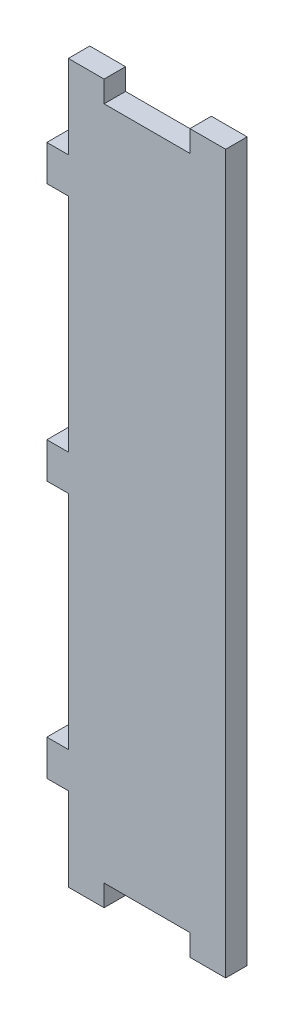
ISO-10303-21;
HEADER;
FILE_DESCRIPTION(('STEP AP214'),'2;1');
FILE_NAME('part.step','',(''),(''),'','','');
FILE_SCHEMA(('AUTOMOTIVE_DESIGN { 1 0 10303 214 1 1 1 1 }'));
ENDSEC;
DATA;
#1=APPLICATION_CONTEXT('core data for automotive mechanical design processes');
#2=APPLICATION_PROTOCOL_DEFINITION('international standard','automotive_design',2000,#1);
#3=PRODUCT_CONTEXT('',#1,'mechanical');
#4=PRODUCT('Part','Part','',(#3));
#5=PRODUCT_RELATED_PRODUCT_CATEGORY('part','',(#4));
#6=PRODUCT_DEFINITION_FORMATION('','',#4);
#7=PRODUCT_DEFINITION_CONTEXT('part definition',#1,'design');
#8=PRODUCT_DEFINITION('design','',#6,#7);
#9=PRODUCT_DEFINITION_SHAPE('','',#8);
#10=(LENGTH_UNIT() NAMED_UNIT(*) SI_UNIT(.MILLI.,.METRE.));
#11=(NAMED_UNIT(*) PLANE_ANGLE_UNIT() SI_UNIT($,.RADIAN.));
#12=(NAMED_UNIT(*) SI_UNIT($,.STERADIAN.) SOLID_ANGLE_UNIT());
#13=UNCERTAINTY_MEASURE_WITH_UNIT(LENGTH_MEASURE(1.E-05),#10,'distance_accuracy_value','');
#14=(GEOMETRIC_REPRESENTATION_CONTEXT(3) GLOBAL_UNCERTAINTY_ASSIGNED_CONTEXT((#13)) GLOBAL_UNIT_ASSIGNED_CONTEXT((#10,
#11,#12)) REPRESENTATION_CONTEXT('',''));
#15=CARTESIAN_POINT('',(0.,0.,0.));
#16=DIRECTION('',(0.,0.,1.));
#17=DIRECTION('',(1.,0.,0.));
#18=AXIS2_PLACEMENT_3D('',#15,#16,#17);
#19=CARTESIAN_POINT('',(0.,0.,-18.));
#20=DIRECTION('',(0.,0.,-1.));
#21=DIRECTION('',(-1.,0.,0.));
#22=AXIS2_PLACEMENT_3D('',#19,#20,#21);
#23=PLANE('',#22);
#24=DIRECTION('',(1.,0.,0.));
#25=VECTOR('',#24,1.);
#26=CARTESIAN_POINT('',(0.,0.,-18.));
#27=LINE('',#26,#25);
#28=CARTESIAN_POINT('',(48.,0.,-18.));
#29=VERTEX_POINT('',#28);
#30=CARTESIAN_POINT('',(120.,0.,-18.));
#31=VERTEX_POINT('',#30);
#32=EDGE_CURVE('E196',#29,#31,#27,.T.);
#33=ORIENTED_EDGE('',*,*,#32,.F.);
#34=DIRECTION('',(0.,1.,0.));
#35=VECTOR('',#34,1.);
#36=CARTESIAN_POINT('',(48.,0.,-18.));
#37=LINE('',#36,#35);
#38=CARTESIAN_POINT('',(48.,-18.,-18.));
#39=VERTEX_POINT('',#38);
#40=EDGE_CURVE('E204',#39,#29,#37,.T.);
#41=ORIENTED_EDGE('',*,*,#40,.F.);
#42=DIRECTION('',(1.,0.,0.));
#43=VECTOR('',#42,1.);
#44=CARTESIAN_POINT('',(0.,-18.,-18.));
#45=LINE('',#44,#43);
#46=CARTESIAN_POINT('',(18.0000000000001,-17.9999999999999,-18.));
#47=VERTEX_POINT('',#46);
#48=EDGE_CURVE('E348',#47,#39,#45,.T.);
#49=ORIENTED_EDGE('',*,*,#48,.F.);
#50=DIRECTION('',(0.,1.,0.));
#51=VECTOR('',#50,1.);
#52=CARTESIAN_POINT('',(18.0000000000001,-17.9999999999999,-18.));
#53=LINE('',#52,#51);
#54=CARTESIAN_POINT('',(18.0000000000001,52.,-18.));
#55=VERTEX_POINT('',#54);
#56=EDGE_CURVE('E254',#47,#55,#53,.T.);
#57=ORIENTED_EDGE('',*,*,#56,.T.);
#58=DIRECTION('',(-1.,0.,0.));
#59=VECTOR('',#58,1.);
#60=CARTESIAN_POINT('',(0.,52.,-18.));
#61=LINE('',#60,#59);
#62=CARTESIAN_POINT('',(0.,52.,-18.));
#63=VERTEX_POINT('',#62);
#64=EDGE_CURVE('E257',#55,#63,#61,.T.);
#65=ORIENTED_EDGE('',*,*,#64,.T.);
#66=DIRECTION('',(0.,-1.,0.));
#67=VECTOR('',#66,1.);
#68=CARTESIAN_POINT('',(0.,-18.,-18.));
#69=LINE('',#68,#67);
#70=CARTESIAN_POINT('',(0.,82.,-18.));
#71=VERTEX_POINT('',#70);
#72=EDGE_CURVE('E347',#71,#63,#69,.T.);
#73=ORIENTED_EDGE('',*,*,#72,.F.);
#74=DIRECTION('',(1.,0.,0.));
#75=VECTOR('',#74,1.);
#76=CARTESIAN_POINT('',(0.,82.,-18.));
#77=LINE('',#76,#75);
#78=CARTESIAN_POINT('',(18.0000000000001,82.,-18.));
#79=VERTEX_POINT('',#78);
#80=EDGE_CURVE('E272',#71,#79,#77,.T.);
#81=ORIENTED_EDGE('',*,*,#80,.T.);
#82=DIRECTION('',(0.,1.,0.));
#83=VECTOR('',#82,1.);
#84=CARTESIAN_POINT('',(18.,268.,-18.));
#85=LINE('',#84,#83);
#86=CARTESIAN_POINT('',(18.,268.,-18.));
#87=VERTEX_POINT('',#86);
#88=EDGE_CURVE('E275',#79,#87,#85,.T.);
#89=ORIENTED_EDGE('',*,*,#88,.T.);
#90=DIRECTION('',(-1.,0.,0.));
#91=VECTOR('',#90,1.);
#92=CARTESIAN_POINT('',(0.,268.,-18.));
#93=LINE('',#92,#91);
#94=CARTESIAN_POINT('',(0.,268.,-18.));
#95=VERTEX_POINT('',#94);
#96=EDGE_CURVE('E279',#87,#95,#93,.T.);
#97=ORIENTED_EDGE('',*,*,#96,.T.);
#98=CARTESIAN_POINT('',(0.,298.,-18.));
#99=VERTEX_POINT('',#98);
#100=EDGE_CURVE('E346',#99,#95,#69,.T.);
#101=ORIENTED_EDGE('',*,*,#100,.F.);
#102=DIRECTION('',(1.,0.,0.));
#103=VECTOR('',#102,1.);
#104=CARTESIAN_POINT('',(0.,298.,-18.));
#105=LINE('',#104,#103);
#106=CARTESIAN_POINT('',(18.,298.,-18.));
#107=VERTEX_POINT('',#106);
#108=EDGE_CURVE('E298',#99,#107,#105,.T.);
#109=ORIENTED_EDGE('',*,*,#108,.T.);
#110=DIRECTION('',(0.,1.,0.));
#111=VECTOR('',#110,1.);
#112=CARTESIAN_POINT('',(17.9999999999999,484.,-18.));
#113=LINE('',#112,#111);
#114=CARTESIAN_POINT('',(17.9999999999999,484.,-18.));
#115=VERTEX_POINT('',#114);
#116=EDGE_CURVE('E301',#107,#115,#113,.T.);
#117=ORIENTED_EDGE('',*,*,#116,.T.);
#118=DIRECTION('',(-1.,0.,0.));
#119=VECTOR('',#118,1.);
#120=CARTESIAN_POINT('',(0.,484.,-18.));
#121=LINE('',#120,#119);
#122=CARTESIAN_POINT('',(0.,484.,-18.));
#123=VERTEX_POINT('',#122);
#124=EDGE_CURVE('E305',#115,#123,#121,.T.);
#125=ORIENTED_EDGE('',*,*,#124,.T.);
#126=CARTESIAN_POINT('',(-1.41446705301519E-13,514.,-18.));
#127=VERTEX_POINT('',#126);
#128=EDGE_CURVE('E343',#127,#123,#69,.T.);
#129=ORIENTED_EDGE('',*,*,#128,.F.);
#130=DIRECTION('',(1.,0.,0.));
#131=VECTOR('',#130,1.);
#132=CARTESIAN_POINT('',(-1.41446705301519E-13,514.,-18.));
#133=LINE('',#132,#131);
#134=CARTESIAN_POINT('',(17.9999999999999,514.,-18.));
#135=VERTEX_POINT('',#134);
#136=EDGE_CURVE('E324',#127,#135,#133,.T.);
#137=ORIENTED_EDGE('',*,*,#136,.T.);
#138=DIRECTION('',(0.,1.,0.));
#139=VECTOR('',#138,1.);
#140=CARTESIAN_POINT('',(17.9999999999999,584.,-18.));
#141=LINE('',#140,#139);
#142=CARTESIAN_POINT('',(17.9999999999999,584.,-18.));
#143=VERTEX_POINT('',#142);
#144=EDGE_CURVE('E327',#135,#143,#141,.T.);
#145=ORIENTED_EDGE('',*,*,#144,.T.);
#146=DIRECTION('',(-1.,0.,0.));
#147=VECTOR('',#146,1.);
#148=CARTESIAN_POINT('',(0.,584.,-18.));
#149=LINE('',#148,#147);
#150=CARTESIAN_POINT('',(47.9999999999999,584.,-18.));
#151=VERTEX_POINT('',#150);
#152=EDGE_CURVE('E354',#151,#143,#149,.T.);
#153=ORIENTED_EDGE('',*,*,#152,.F.);
#154=DIRECTION('',(0.,-1.,0.));
#155=VECTOR('',#154,1.);
#156=CARTESIAN_POINT('',(47.9999999999999,0.,-18.));
#157=LINE('',#156,#155);
#158=CARTESIAN_POINT('',(47.9999999999999,566.,-18.));
#159=VERTEX_POINT('',#158);
#160=EDGE_CURVE('E232',#151,#159,#157,.T.);
#161=ORIENTED_EDGE('',*,*,#160,.T.);
#162=DIRECTION('',(1.,0.,0.));
#163=VECTOR('',#162,1.);
#164=CARTESIAN_POINT('',(0.,566.,-18.));
#165=LINE('',#164,#163);
#166=CARTESIAN_POINT('',(120.,566.,-18.));
#167=VERTEX_POINT('',#166);
#168=EDGE_CURVE('E236',#159,#167,#165,.T.);
#169=ORIENTED_EDGE('',*,*,#168,.T.);
#170=DIRECTION('',(0.,-1.,0.));
#171=VECTOR('',#170,1.);
#172=CARTESIAN_POINT('',(120.,0.,-18.));
#173=LINE('',#172,#171);
#174=CARTESIAN_POINT('',(120.,584.,-18.));
#175=VERTEX_POINT('',#174);
#176=EDGE_CURVE('E230',#175,#167,#173,.T.);
#177=ORIENTED_EDGE('',*,*,#176,.F.);
#178=CARTESIAN_POINT('',(150.,584.,-18.));
#179=VERTEX_POINT('',#178);
#180=EDGE_CURVE('E355',#179,#175,#149,.T.);
#181=ORIENTED_EDGE('',*,*,#180,.F.);
#182=DIRECTION('',(0.,1.,0.));
#183=VECTOR('',#182,1.);
#184=CARTESIAN_POINT('',(150.,-18.,-18.));
#185=LINE('',#184,#183);
#186=CARTESIAN_POINT('',(150.,-18.,-18.));
#187=VERTEX_POINT('',#186);
#188=EDGE_CURVE('E351',#187,#179,#185,.T.);
#189=ORIENTED_EDGE('',*,*,#188,.F.);
#190=CARTESIAN_POINT('',(120.,-18.,-18.));
#191=VERTEX_POINT('',#190);
#192=EDGE_CURVE('E214',#191,#187,#45,.T.);
#193=ORIENTED_EDGE('',*,*,#192,.F.);
#194=DIRECTION('',(0.,1.,0.));
#195=VECTOR('',#194,1.);
#196=CARTESIAN_POINT('',(120.,1.8503717077086E-13,-18.));
#197=LINE('',#196,#195);
#198=EDGE_CURVE('E49',#191,#31,#197,.T.);
#199=ORIENTED_EDGE('',*,*,#198,.T.);
#200=EDGE_LOOP('',(#33,#41,#49,#57,#65,#73,#81,#89,#97,#101,#109,#117,#125,#129,#137,#145,#153,
#161,#169,#177,#181,#189,#193,#199));
#201=FACE_BOUND('',#200,.T.);
#202=ADVANCED_FACE('F34',(#201),#23,.T.);
#203=CARTESIAN_POINT('',(0.,0.,0.));
#204=DIRECTION('',(0.,0.,-1.));
#205=DIRECTION('',(-1.,0.,0.));
#206=AXIS2_PLACEMENT_3D('',#203,#204,#205);
#207=PLANE('',#206);
#208=DIRECTION('',(0.,1.,0.));
#209=VECTOR('',#208,1.);
#210=CARTESIAN_POINT('',(48.,0.,0.));
#211=LINE('',#210,#209);
#212=CARTESIAN_POINT('',(48.,-18.,0.));
#213=VERTEX_POINT('',#212);
#214=CARTESIAN_POINT('',(48.,0.,0.));
#215=VERTEX_POINT('',#214);
#216=EDGE_CURVE('E215',#213,#215,#211,.T.);
#217=ORIENTED_EDGE('',*,*,#216,.T.);
#218=DIRECTION('',(1.,0.,0.));
#219=VECTOR('',#218,1.);
#220=CARTESIAN_POINT('',(0.,0.,0.));
#221=LINE('',#220,#219);
#222=CARTESIAN_POINT('',(120.,0.,0.));
#223=VERTEX_POINT('',#222);
#224=EDGE_CURVE('E218',#215,#223,#221,.T.);
#225=ORIENTED_EDGE('',*,*,#224,.T.);
#226=DIRECTION('',(0.,1.,0.));
#227=VECTOR('',#226,1.);
#228=CARTESIAN_POINT('',(120.,1.8503717077086E-13,0.));
#229=LINE('',#228,#227);
#230=CARTESIAN_POINT('',(120.,-18.,0.));
#231=VERTEX_POINT('',#230);
#232=EDGE_CURVE('E208',#231,#223,#229,.T.);
#233=ORIENTED_EDGE('',*,*,#232,.F.);
#234=DIRECTION('',(1.,0.,0.));
#235=VECTOR('',#234,1.);
#236=CARTESIAN_POINT('',(0.,-18.,0.));
#237=LINE('',#236,#235);
#238=CARTESIAN_POINT('',(150.,-18.,0.));
#239=VERTEX_POINT('',#238);
#240=EDGE_CURVE('E361',#231,#239,#237,.T.);
#241=ORIENTED_EDGE('',*,*,#240,.T.);
#242=DIRECTION('',(0.,1.,0.));
#243=VECTOR('',#242,1.);
#244=CARTESIAN_POINT('',(150.,-18.,0.));
#245=LINE('',#244,#243);
#246=CARTESIAN_POINT('',(150.,584.,0.));
#247=VERTEX_POINT('',#246);
#248=EDGE_CURVE('E366',#239,#247,#245,.T.);
#249=ORIENTED_EDGE('',*,*,#248,.T.);
#250=DIRECTION('',(-1.,0.,0.));
#251=VECTOR('',#250,1.);
#252=CARTESIAN_POINT('',(0.,584.,0.));
#253=LINE('',#252,#251);
#254=CARTESIAN_POINT('',(120.,584.,0.));
#255=VERTEX_POINT('',#254);
#256=EDGE_CURVE('E370',#247,#255,#253,.T.);
#257=ORIENTED_EDGE('',*,*,#256,.T.);
#258=DIRECTION('',(0.,-1.,0.));
#259=VECTOR('',#258,1.);
#260=CARTESIAN_POINT('',(120.,0.,0.));
#261=LINE('',#260,#259);
#262=CARTESIAN_POINT('',(120.,566.,0.));
#263=VERTEX_POINT('',#262);
#264=EDGE_CURVE('E227',#255,#263,#261,.T.);
#265=ORIENTED_EDGE('',*,*,#264,.T.);
#266=DIRECTION('',(1.,0.,0.));
#267=VECTOR('',#266,1.);
#268=CARTESIAN_POINT('',(0.,566.,0.));
#269=LINE('',#268,#267);
#270=CARTESIAN_POINT('',(47.9999999999999,566.,0.));
#271=VERTEX_POINT('',#270);
#272=EDGE_CURVE('E233',#271,#263,#269,.T.);
#273=ORIENTED_EDGE('',*,*,#272,.F.);
#274=DIRECTION('',(0.,-1.,0.));
#275=VECTOR('',#274,1.);
#276=CARTESIAN_POINT('',(47.9999999999999,0.,0.));
#277=LINE('',#276,#275);
#278=CARTESIAN_POINT('',(47.9999999999999,584.,0.));
#279=VERTEX_POINT('',#278);
#280=EDGE_CURVE('E242',#279,#271,#277,.T.);
#281=ORIENTED_EDGE('',*,*,#280,.F.);
#282=CARTESIAN_POINT('',(17.9999999999999,584.,0.));
#283=VERTEX_POINT('',#282);
#284=EDGE_CURVE('E369',#279,#283,#253,.T.);
#285=ORIENTED_EDGE('',*,*,#284,.T.);
#286=DIRECTION('',(0.,1.,0.));
#287=VECTOR('',#286,1.);
#288=CARTESIAN_POINT('',(17.9999999999999,584.,0.));
#289=LINE('',#288,#287);
#290=CARTESIAN_POINT('',(17.9999999999999,514.,0.));
#291=VERTEX_POINT('',#290);
#292=EDGE_CURVE('E328',#291,#283,#289,.T.);
#293=ORIENTED_EDGE('',*,*,#292,.F.);
#294=DIRECTION('',(1.,0.,0.));
#295=VECTOR('',#294,1.);
#296=CARTESIAN_POINT('',(-1.41446705301519E-13,514.,0.));
#297=LINE('',#296,#295);
#298=CARTESIAN_POINT('',(0.,514.,0.));
#299=VERTEX_POINT('',#298);
#300=EDGE_CURVE('E318',#299,#291,#297,.T.);
#301=ORIENTED_EDGE('',*,*,#300,.F.);
#302=DIRECTION('',(0.,-1.,0.));
#303=VECTOR('',#302,1.);
#304=CARTESIAN_POINT('',(0.,-18.,0.));
#305=LINE('',#304,#303);
#306=CARTESIAN_POINT('',(0.,484.,0.));
#307=VERTEX_POINT('',#306);
#308=EDGE_CURVE('E358',#299,#307,#305,.T.);
#309=ORIENTED_EDGE('',*,*,#308,.T.);
#310=DIRECTION('',(-1.,0.,0.));
#311=VECTOR('',#310,1.);
#312=CARTESIAN_POINT('',(0.,484.,0.));
#313=LINE('',#312,#311);
#314=CARTESIAN_POINT('',(17.9999999999999,484.,0.));
#315=VERTEX_POINT('',#314);
#316=EDGE_CURVE('E302',#315,#307,#313,.T.);
#317=ORIENTED_EDGE('',*,*,#316,.F.);
#318=DIRECTION('',(0.,1.,0.));
#319=VECTOR('',#318,1.);
#320=CARTESIAN_POINT('',(17.9999999999999,484.,0.));
#321=LINE('',#320,#319);
#322=CARTESIAN_POINT('',(18.,298.,0.));
#323=VERTEX_POINT('',#322);
#324=EDGE_CURVE('E311',#323,#315,#321,.T.);
#325=ORIENTED_EDGE('',*,*,#324,.F.);
#326=DIRECTION('',(1.,0.,0.));
#327=VECTOR('',#326,1.);
#328=CARTESIAN_POINT('',(0.,298.,0.));
#329=LINE('',#328,#327);
#330=CARTESIAN_POINT('',(0.,298.,0.));
#331=VERTEX_POINT('',#330);
#332=EDGE_CURVE('E292',#331,#323,#329,.T.);
#333=ORIENTED_EDGE('',*,*,#332,.F.);
#334=CARTESIAN_POINT('',(0.,268.,0.));
#335=VERTEX_POINT('',#334);
#336=EDGE_CURVE('E362',#331,#335,#305,.T.);
#337=ORIENTED_EDGE('',*,*,#336,.T.);
#338=DIRECTION('',(-1.,0.,0.));
#339=VECTOR('',#338,1.);
#340=CARTESIAN_POINT('',(0.,268.,0.));
#341=LINE('',#340,#339);
#342=CARTESIAN_POINT('',(18.,268.,0.));
#343=VERTEX_POINT('',#342);
#344=EDGE_CURVE('E276',#343,#335,#341,.T.);
#345=ORIENTED_EDGE('',*,*,#344,.F.);
#346=DIRECTION('',(0.,1.,0.));
#347=VECTOR('',#346,1.);
#348=CARTESIAN_POINT('',(18.,268.,0.));
#349=LINE('',#348,#347);
#350=CARTESIAN_POINT('',(18.0000000000001,82.,0.));
#351=VERTEX_POINT('',#350);
#352=EDGE_CURVE('E285',#351,#343,#349,.T.);
#353=ORIENTED_EDGE('',*,*,#352,.F.);
#354=DIRECTION('',(1.,0.,0.));
#355=VECTOR('',#354,1.);
#356=CARTESIAN_POINT('',(0.,82.,0.));
#357=LINE('',#356,#355);
#358=CARTESIAN_POINT('',(0.,82.,0.));
#359=VERTEX_POINT('',#358);
#360=EDGE_CURVE('E268',#359,#351,#357,.T.);
#361=ORIENTED_EDGE('',*,*,#360,.F.);
#362=CARTESIAN_POINT('',(0.,52.,0.));
#363=VERTEX_POINT('',#362);
#364=EDGE_CURVE('E339',#359,#363,#305,.T.);
#365=ORIENTED_EDGE('',*,*,#364,.T.);
#366=DIRECTION('',(-1.,0.,0.));
#367=VECTOR('',#366,1.);
#368=CARTESIAN_POINT('',(0.,52.,0.));
#369=LINE('',#368,#367);
#370=CARTESIAN_POINT('',(18.0000000000001,52.,0.));
#371=VERTEX_POINT('',#370);
#372=EDGE_CURVE('E258',#371,#363,#369,.T.);
#373=ORIENTED_EDGE('',*,*,#372,.F.);
#374=DIRECTION('',(0.,1.,0.));
#375=VECTOR('',#374,1.);
#376=CARTESIAN_POINT('',(18.0000000000001,-17.9999999999999,0.));
#377=LINE('',#376,#375);
#378=CARTESIAN_POINT('',(18.0000000000001,-18.,0.));
#379=VERTEX_POINT('',#378);
#380=EDGE_CURVE('E248',#379,#371,#377,.T.);
#381=ORIENTED_EDGE('',*,*,#380,.F.);
#382=EDGE_CURVE('E363',#379,#213,#237,.T.);
#383=ORIENTED_EDGE('',*,*,#382,.T.);
#384=EDGE_LOOP('',(#217,#225,#233,#241,#249,#257,#265,#273,#281,#285,#293,#301,#309,#317,#325,
#333,#337,#345,#353,#361,#365,#373,#381,#383));
#385=FACE_BOUND('',#384,.T.);
#386=ADVANCED_FACE('F377',(#385),#207,.F.);
#387=CARTESIAN_POINT('',(0.,-18.,-18.));
#388=DIRECTION('',(0.,-1.,0.));
#389=DIRECTION('',(0.,0.,-1.));
#390=AXIS2_PLACEMENT_3D('',#387,#388,#389);
#391=PLANE('',#390);
#392=ORIENTED_EDGE('',*,*,#48,.T.);
#393=DIRECTION('',(0.,0.,1.));
#394=VECTOR('',#393,1.);
#395=CARTESIAN_POINT('',(48.,-18.,-18.));
#396=LINE('',#395,#394);
#397=EDGE_CURVE('E224',#39,#213,#396,.T.);
#398=ORIENTED_EDGE('',*,*,#397,.T.);
#399=ORIENTED_EDGE('',*,*,#382,.F.);
#400=DIRECTION('',(0.,0.,1.));
#401=VECTOR('',#400,1.);
#402=CARTESIAN_POINT('',(18.0000000000001,-17.9999999999999,-18.));
#403=LINE('',#402,#401);
#404=EDGE_CURVE('E261',#47,#379,#403,.T.);
#405=ORIENTED_EDGE('',*,*,#404,.F.);
#406=EDGE_LOOP('',(#392,#398,#399,#405));
#407=FACE_BOUND('',#406,.T.);
#408=ADVANCED_FACE('F431',(#407),#391,.T.);
#409=CARTESIAN_POINT('',(0.,584.,-18.));
#410=DIRECTION('',(0.,1.,0.));
#411=DIRECTION('',(0.,0.,1.));
#412=AXIS2_PLACEMENT_3D('',#409,#410,#411);
#413=PLANE('',#412);
#414=ORIENTED_EDGE('',*,*,#180,.T.);
#415=DIRECTION('',(0.,0.,1.));
#416=VECTOR('',#415,1.);
#417=CARTESIAN_POINT('',(120.,584.,-18.));
#418=LINE('',#417,#416);
#419=EDGE_CURVE('E239',#175,#255,#418,.T.);
#420=ORIENTED_EDGE('',*,*,#419,.T.);
#421=ORIENTED_EDGE('',*,*,#256,.F.);
#422=DIRECTION('',(0.,0.,1.));
#423=VECTOR('',#422,1.);
#424=CARTESIAN_POINT('',(150.,584.,-18.));
#425=LINE('',#424,#423);
#426=EDGE_CURVE('E11',#179,#247,#425,.T.);
#427=ORIENTED_EDGE('',*,*,#426,.F.);
#428=EDGE_LOOP('',(#414,#420,#421,#427));
#429=FACE_BOUND('',#428,.T.);
#430=ADVANCED_FACE('F456',(#429),#413,.T.);
#431=CARTESIAN_POINT('',(0.,-18.,-18.));
#432=DIRECTION('',(-1.,0.,0.));
#433=DIRECTION('',(0.,-1.,0.));
#434=AXIS2_PLACEMENT_3D('',#431,#432,#433);
#435=PLANE('',#434);
#436=DIRECTION('',(0.,0.,1.));
#437=VECTOR('',#436,1.);
#438=CARTESIAN_POINT('',(0.,268.,-18.));
#439=LINE('',#438,#437);
#440=EDGE_CURVE('E289',#95,#335,#439,.T.);
#441=ORIENTED_EDGE('',*,*,#440,.T.);
#442=ORIENTED_EDGE('',*,*,#336,.F.);
#443=DIRECTION('',(0.,0.,1.));
#444=VECTOR('',#443,1.);
#445=CARTESIAN_POINT('',(0.,298.,-18.));
#446=LINE('',#445,#444);
#447=EDGE_CURVE('E308',#99,#331,#446,.T.);
#448=ORIENTED_EDGE('',*,*,#447,.F.);
#449=ORIENTED_EDGE('',*,*,#100,.T.);
#450=EDGE_LOOP('',(#441,#442,#448,#449));
#451=FACE_BOUND('',#450,.T.);
#452=ADVANCED_FACE('F410',(#451),#435,.T.);
#453=DIRECTION('',(0.,0.,1.));
#454=VECTOR('',#453,1.);
#455=CARTESIAN_POINT('',(0.,484.,-18.));
#456=LINE('',#455,#454);
#457=EDGE_CURVE('E315',#123,#307,#456,.T.);
#458=ORIENTED_EDGE('',*,*,#457,.T.);
#459=ORIENTED_EDGE('',*,*,#308,.F.);
#460=DIRECTION('',(0.,0.,1.));
#461=VECTOR('',#460,1.);
#462=CARTESIAN_POINT('',(-1.41446705301519E-13,514.,-18.));
#463=LINE('',#462,#461);
#464=EDGE_CURVE('E331',#127,#299,#463,.T.);
#465=ORIENTED_EDGE('',*,*,#464,.F.);
#466=ORIENTED_EDGE('',*,*,#128,.T.);
#467=EDGE_LOOP('',(#458,#459,#465,#466));
#468=FACE_BOUND('',#467,.T.);
#469=ADVANCED_FACE('F393',(#468),#435,.T.);
#470=DIRECTION('',(0.,0.,1.));
#471=VECTOR('',#470,1.);
#472=CARTESIAN_POINT('',(0.,52.,-18.));
#473=LINE('',#472,#471);
#474=EDGE_CURVE('E265',#63,#363,#473,.T.);
#475=ORIENTED_EDGE('',*,*,#474,.T.);
#476=ORIENTED_EDGE('',*,*,#364,.F.);
#477=DIRECTION('',(0.,0.,1.));
#478=VECTOR('',#477,1.);
#479=CARTESIAN_POINT('',(0.,82.,-18.));
#480=LINE('',#479,#478);
#481=EDGE_CURVE('E282',#71,#359,#480,.T.);
#482=ORIENTED_EDGE('',*,*,#481,.F.);
#483=ORIENTED_EDGE('',*,*,#72,.T.);
#484=EDGE_LOOP('',(#475,#476,#482,#483));
#485=FACE_BOUND('',#484,.T.);
#486=ADVANCED_FACE('F36',(#485),#435,.T.);
#487=DIRECTION('',(0.,0.,1.));
#488=VECTOR('',#487,1.);
#489=CARTESIAN_POINT('',(47.9999999999999,584.,-18.));
#490=LINE('',#489,#488);
#491=EDGE_CURVE('E57',#151,#279,#490,.T.);
#492=ORIENTED_EDGE('',*,*,#491,.F.);
#493=ORIENTED_EDGE('',*,*,#152,.T.);
#494=DIRECTION('',(0.,0.,1.));
#495=VECTOR('',#494,1.);
#496=CARTESIAN_POINT('',(17.9999999999999,584.,-18.));
#497=LINE('',#496,#495);
#498=EDGE_CURVE('E336',#143,#283,#497,.T.);
#499=ORIENTED_EDGE('',*,*,#498,.T.);
#500=ORIENTED_EDGE('',*,*,#284,.F.);
#501=EDGE_LOOP('',(#492,#493,#499,#500));
#502=FACE_BOUND('',#501,.T.);
#503=ADVANCED_FACE('F385',(#502),#413,.T.);
#504=CARTESIAN_POINT('',(150.,-18.,-18.));
#505=DIRECTION('',(1.,0.,0.));
#506=DIRECTION('',(0.,0.,-1.));
#507=AXIS2_PLACEMENT_3D('',#504,#505,#506);
#508=PLANE('',#507);
#509=ORIENTED_EDGE('',*,*,#248,.F.);
#510=DIRECTION('',(0.,0.,1.));
#511=VECTOR('',#510,1.);
#512=CARTESIAN_POINT('',(150.,-18.,-18.));
#513=LINE('',#512,#511);
#514=EDGE_CURVE('E38',#187,#239,#513,.T.);
#515=ORIENTED_EDGE('',*,*,#514,.F.);
#516=ORIENTED_EDGE('',*,*,#188,.T.);
#517=ORIENTED_EDGE('',*,*,#426,.T.);
#518=EDGE_LOOP('',(#509,#515,#516,#517));
#519=FACE_BOUND('',#518,.T.);
#520=ADVANCED_FACE('F455',(#519),#508,.T.);
#521=DIRECTION('',(0.,0.,1.));
#522=VECTOR('',#521,1.);
#523=CARTESIAN_POINT('',(120.,-18.,-18.));
#524=LINE('',#523,#522);
#525=EDGE_CURVE('E210',#191,#231,#524,.T.);
#526=ORIENTED_EDGE('',*,*,#525,.F.);
#527=ORIENTED_EDGE('',*,*,#192,.T.);
#528=ORIENTED_EDGE('',*,*,#514,.T.);
#529=ORIENTED_EDGE('',*,*,#240,.F.);
#530=EDGE_LOOP('',(#526,#527,#528,#529));
#531=FACE_BOUND('',#530,.T.);
#532=ADVANCED_FACE('F458',(#531),#391,.T.);
#533=CARTESIAN_POINT('',(17.9999999999999,584.,-18.));
#534=DIRECTION('',(1.,0.,0.));
#535=DIRECTION('',(0.,1.,0.));
#536=AXIS2_PLACEMENT_3D('',#533,#534,#535);
#537=PLANE('',#536);
#538=ORIENTED_EDGE('',*,*,#292,.T.);
#539=ORIENTED_EDGE('',*,*,#498,.F.);
#540=ORIENTED_EDGE('',*,*,#144,.F.);
#541=DIRECTION('',(0.,0.,1.));
#542=VECTOR('',#541,1.);
#543=CARTESIAN_POINT('',(17.9999999999999,514.,-18.));
#544=LINE('',#543,#542);
#545=EDGE_CURVE('E340',#135,#291,#544,.T.);
#546=ORIENTED_EDGE('',*,*,#545,.T.);
#547=EDGE_LOOP('',(#538,#539,#540,#546));
#548=FACE_BOUND('',#547,.T.);
#549=ADVANCED_FACE('F383',(#548),#537,.F.);
#550=CARTESIAN_POINT('',(-1.41446705301519E-13,514.,-18.));
#551=DIRECTION('',(0.,-1.,0.));
#552=DIRECTION('',(0.,0.,-1.));
#553=AXIS2_PLACEMENT_3D('',#550,#551,#552);
#554=PLANE('',#553);
#555=ORIENTED_EDGE('',*,*,#300,.T.);
#556=ORIENTED_EDGE('',*,*,#545,.F.);
#557=ORIENTED_EDGE('',*,*,#136,.F.);
#558=ORIENTED_EDGE('',*,*,#464,.T.);
#559=EDGE_LOOP('',(#555,#556,#557,#558));
#560=FACE_BOUND('',#559,.T.);
#561=ADVANCED_FACE('F390',(#560),#554,.F.);
#562=CARTESIAN_POINT('',(0.,484.,-18.));
#563=DIRECTION('',(0.,1.,0.));
#564=DIRECTION('',(0.,0.,1.));
#565=AXIS2_PLACEMENT_3D('',#562,#563,#564);
#566=PLANE('',#565);
#567=ORIENTED_EDGE('',*,*,#316,.T.);
#568=ORIENTED_EDGE('',*,*,#457,.F.);
#569=ORIENTED_EDGE('',*,*,#124,.F.);
#570=DIRECTION('',(0.,0.,1.));
#571=VECTOR('',#570,1.);
#572=CARTESIAN_POINT('',(17.9999999999999,484.,-18.));
#573=LINE('',#572,#571);
#574=EDGE_CURVE('E319',#115,#315,#573,.T.);
#575=ORIENTED_EDGE('',*,*,#574,.T.);
#576=EDGE_LOOP('',(#567,#568,#569,#575));
#577=FACE_BOUND('',#576,.T.);
#578=ADVANCED_FACE('F398',(#577),#566,.F.);
#579=CARTESIAN_POINT('',(17.9999999999999,484.,-18.));
#580=DIRECTION('',(1.,0.,0.));
#581=DIRECTION('',(0.,1.,0.));
#582=AXIS2_PLACEMENT_3D('',#579,#580,#581);
#583=PLANE('',#582);
#584=ORIENTED_EDGE('',*,*,#324,.T.);
#585=ORIENTED_EDGE('',*,*,#574,.F.);
#586=ORIENTED_EDGE('',*,*,#116,.F.);
#587=DIRECTION('',(0.,0.,1.));
#588=VECTOR('',#587,1.);
#589=CARTESIAN_POINT('',(18.,298.,-18.));
#590=LINE('',#589,#588);
#591=EDGE_CURVE('E321',#107,#323,#590,.T.);
#592=ORIENTED_EDGE('',*,*,#591,.T.);
#593=EDGE_LOOP('',(#584,#585,#586,#592));
#594=FACE_BOUND('',#593,.T.);
#595=ADVANCED_FACE('F402',(#594),#583,.F.);
#596=CARTESIAN_POINT('',(0.,298.,-18.));
#597=DIRECTION('',(0.,-1.,0.));
#598=DIRECTION('',(0.,0.,-1.));
#599=AXIS2_PLACEMENT_3D('',#596,#597,#598);
#600=PLANE('',#599);
#601=ORIENTED_EDGE('',*,*,#332,.T.);
#602=ORIENTED_EDGE('',*,*,#591,.F.);
#603=ORIENTED_EDGE('',*,*,#108,.F.);
#604=ORIENTED_EDGE('',*,*,#447,.T.);
#605=EDGE_LOOP('',(#601,#602,#603,#604));
#606=FACE_BOUND('',#605,.T.);
#607=ADVANCED_FACE('F404',(#606),#600,.F.);
#608=CARTESIAN_POINT('',(0.,268.,-18.));
#609=DIRECTION('',(0.,1.,0.));
#610=DIRECTION('',(0.,0.,1.));
#611=AXIS2_PLACEMENT_3D('',#608,#609,#610);
#612=PLANE('',#611);
#613=ORIENTED_EDGE('',*,*,#344,.T.);
#614=ORIENTED_EDGE('',*,*,#440,.F.);
#615=ORIENTED_EDGE('',*,*,#96,.F.);
#616=DIRECTION('',(0.,0.,1.));
#617=VECTOR('',#616,1.);
#618=CARTESIAN_POINT('',(18.,268.,-18.));
#619=LINE('',#618,#617);
#620=EDGE_CURVE('E293',#87,#343,#619,.T.);
#621=ORIENTED_EDGE('',*,*,#620,.T.);
#622=EDGE_LOOP('',(#613,#614,#615,#621));
#623=FACE_BOUND('',#622,.T.);
#624=ADVANCED_FACE('F493',(#623),#612,.F.);
#625=CARTESIAN_POINT('',(18.,268.,-18.));
#626=DIRECTION('',(1.,0.,0.));
#627=DIRECTION('',(0.,1.,0.));
#628=AXIS2_PLACEMENT_3D('',#625,#626,#627);
#629=PLANE('',#628);
#630=ORIENTED_EDGE('',*,*,#352,.T.);
#631=ORIENTED_EDGE('',*,*,#620,.F.);
#632=ORIENTED_EDGE('',*,*,#88,.F.);
#633=DIRECTION('',(0.,0.,1.));
#634=VECTOR('',#633,1.);
#635=CARTESIAN_POINT('',(18.0000000000001,82.,-18.));
#636=LINE('',#635,#634);
#637=EDGE_CURVE('E295',#79,#351,#636,.T.);
#638=ORIENTED_EDGE('',*,*,#637,.T.);
#639=EDGE_LOOP('',(#630,#631,#632,#638));
#640=FACE_BOUND('',#639,.T.);
#641=ADVANCED_FACE('F496',(#640),#629,.F.);
#642=CARTESIAN_POINT('',(0.,82.,-18.));
#643=DIRECTION('',(0.,-1.,0.));
#644=DIRECTION('',(0.,0.,-1.));
#645=AXIS2_PLACEMENT_3D('',#642,#643,#644);
#646=PLANE('',#645);
#647=ORIENTED_EDGE('',*,*,#360,.T.);
#648=ORIENTED_EDGE('',*,*,#637,.F.);
#649=ORIENTED_EDGE('',*,*,#80,.F.);
#650=ORIENTED_EDGE('',*,*,#481,.T.);
#651=EDGE_LOOP('',(#647,#648,#649,#650));
#652=FACE_BOUND('',#651,.T.);
#653=ADVANCED_FACE('F490',(#652),#646,.F.);
#654=CARTESIAN_POINT('',(0.,52.,-18.));
#655=DIRECTION('',(0.,1.,0.));
#656=DIRECTION('',(0.,0.,1.));
#657=AXIS2_PLACEMENT_3D('',#654,#655,#656);
#658=PLANE('',#657);
#659=ORIENTED_EDGE('',*,*,#372,.T.);
#660=ORIENTED_EDGE('',*,*,#474,.F.);
#661=ORIENTED_EDGE('',*,*,#64,.F.);
#662=DIRECTION('',(0.,0.,1.));
#663=VECTOR('',#662,1.);
#664=CARTESIAN_POINT('',(18.0000000000001,52.,-18.));
#665=LINE('',#664,#663);
#666=EDGE_CURVE('E269',#55,#371,#665,.T.);
#667=ORIENTED_EDGE('',*,*,#666,.T.);
#668=EDGE_LOOP('',(#659,#660,#661,#667));
#669=FACE_BOUND('',#668,.T.);
#670=ADVANCED_FACE('F424',(#669),#658,.F.);
#671=CARTESIAN_POINT('',(18.0000000000001,-17.9999999999999,-18.));
#672=DIRECTION('',(1.,0.,0.));
#673=DIRECTION('',(0.,1.,0.));
#674=AXIS2_PLACEMENT_3D('',#671,#672,#673);
#675=PLANE('',#674);
#676=ORIENTED_EDGE('',*,*,#380,.T.);
#677=ORIENTED_EDGE('',*,*,#666,.F.);
#678=ORIENTED_EDGE('',*,*,#56,.F.);
#679=ORIENTED_EDGE('',*,*,#404,.T.);
#680=EDGE_LOOP('',(#676,#677,#678,#679));
#681=FACE_BOUND('',#680,.T.);
#682=ADVANCED_FACE('F428',(#681),#675,.F.);
#683=CARTESIAN_POINT('',(120.,0.,-18.));
#684=DIRECTION('',(-1.,0.,0.));
#685=DIRECTION('',(0.,0.,1.));
#686=AXIS2_PLACEMENT_3D('',#683,#684,#685);
#687=PLANE('',#686);
#688=ORIENTED_EDGE('',*,*,#264,.F.);
#689=ORIENTED_EDGE('',*,*,#419,.F.);
#690=ORIENTED_EDGE('',*,*,#176,.T.);
#691=DIRECTION('',(0.,0.,1.));
#692=VECTOR('',#691,1.);
#693=CARTESIAN_POINT('',(120.,566.,-18.));
#694=LINE('',#693,#692);
#695=EDGE_CURVE('E246',#167,#263,#694,.T.);
#696=ORIENTED_EDGE('',*,*,#695,.T.);
#697=EDGE_LOOP('',(#688,#689,#690,#696));
#698=FACE_BOUND('',#697,.T.);
#699=ADVANCED_FACE('F478',(#698),#687,.T.);
#700=CARTESIAN_POINT('',(0.,566.,-18.));
#701=DIRECTION('',(0.,-1.,0.));
#702=DIRECTION('',(0.,0.,-1.));
#703=AXIS2_PLACEMENT_3D('',#700,#701,#702);
#704=PLANE('',#703);
#705=ORIENTED_EDGE('',*,*,#272,.T.);
#706=ORIENTED_EDGE('',*,*,#695,.F.);
#707=ORIENTED_EDGE('',*,*,#168,.F.);
#708=DIRECTION('',(0.,0.,1.));
#709=VECTOR('',#708,1.);
#710=CARTESIAN_POINT('',(47.9999999999999,566.,-18.));
#711=LINE('',#710,#709);
#712=EDGE_CURVE('E249',#159,#271,#711,.T.);
#713=ORIENTED_EDGE('',*,*,#712,.T.);
#714=EDGE_LOOP('',(#705,#706,#707,#713));
#715=FACE_BOUND('',#714,.T.);
#716=ADVANCED_FACE('F442',(#715),#704,.F.);
#717=CARTESIAN_POINT('',(47.9999999999999,0.,-18.));
#718=DIRECTION('',(-1.,0.,0.));
#719=DIRECTION('',(0.,0.,1.));
#720=AXIS2_PLACEMENT_3D('',#717,#718,#719);
#721=PLANE('',#720);
#722=ORIENTED_EDGE('',*,*,#280,.T.);
#723=ORIENTED_EDGE('',*,*,#712,.F.);
#724=ORIENTED_EDGE('',*,*,#160,.F.);
#725=ORIENTED_EDGE('',*,*,#491,.T.);
#726=EDGE_LOOP('',(#722,#723,#724,#725));
#727=FACE_BOUND('',#726,.T.);
#728=ADVANCED_FACE('F435',(#727),#721,.F.);
#729=CARTESIAN_POINT('',(48.,0.,-18.));
#730=DIRECTION('',(1.,0.,0.));
#731=DIRECTION('',(0.,1.,0.));
#732=AXIS2_PLACEMENT_3D('',#729,#730,#731);
#733=PLANE('',#732);
#734=ORIENTED_EDGE('',*,*,#216,.F.);
#735=ORIENTED_EDGE('',*,*,#397,.F.);
#736=ORIENTED_EDGE('',*,*,#40,.T.);
#737=DIRECTION('',(0.,0.,1.));
#738=VECTOR('',#737,1.);
#739=CARTESIAN_POINT('',(48.,0.,-18.));
#740=LINE('',#739,#738);
#741=EDGE_CURVE('E201',#29,#215,#740,.T.);
#742=ORIENTED_EDGE('',*,*,#741,.T.);
#743=EDGE_LOOP('',(#734,#735,#736,#742));
#744=FACE_BOUND('',#743,.T.);
#745=ADVANCED_FACE('F433',(#744),#733,.T.);
#746=CARTESIAN_POINT('',(0.,0.,-18.));
#747=DIRECTION('',(0.,-1.,0.));
#748=DIRECTION('',(1.,0.,0.));
#749=AXIS2_PLACEMENT_3D('',#746,#747,#748);
#750=PLANE('',#749);
#751=ORIENTED_EDGE('',*,*,#224,.F.);
#752=ORIENTED_EDGE('',*,*,#741,.F.);
#753=ORIENTED_EDGE('',*,*,#32,.T.);
#754=DIRECTION('',(0.,0.,1.));
#755=VECTOR('',#754,1.);
#756=CARTESIAN_POINT('',(120.,0.,-18.));
#757=LINE('',#756,#755);
#758=EDGE_CURVE('E199',#31,#223,#757,.T.);
#759=ORIENTED_EDGE('',*,*,#758,.T.);
#760=EDGE_LOOP('',(#751,#752,#753,#759));
#761=FACE_BOUND('',#760,.T.);
#762=ADVANCED_FACE('F198',(#761),#750,.T.);
#763=CARTESIAN_POINT('',(120.,1.8503717077086E-13,-18.));
#764=DIRECTION('',(1.,0.,0.));
#765=DIRECTION('',(0.,1.,0.));
#766=AXIS2_PLACEMENT_3D('',#763,#764,#765);
#767=PLANE('',#766);
#768=ORIENTED_EDGE('',*,*,#232,.T.);
#769=ORIENTED_EDGE('',*,*,#758,.F.);
#770=ORIENTED_EDGE('',*,*,#198,.F.);
#771=ORIENTED_EDGE('',*,*,#525,.T.);
#772=EDGE_LOOP('',(#768,#769,#770,#771));
#773=FACE_BOUND('',#772,.T.);
#774=ADVANCED_FACE('F206',(#773),#767,.F.);
#775=CLOSED_SHELL('',(#202,#386,#408,#430,#452,#469,#486,#503,#520,#532,#549,#561,#578,#595,
#607,#624,#641,#653,#670,#682,#699,#716,#728,#745,#762,#774));
#776=MANIFOLD_SOLID_BREP('B2',#775);
#777=ADVANCED_BREP_SHAPE_REPRESENTATION('',(#18,#776),#14);
#778=SHAPE_DEFINITION_REPRESENTATION(#9,#777);
ENDSEC;
END-ISO-10303-21;
